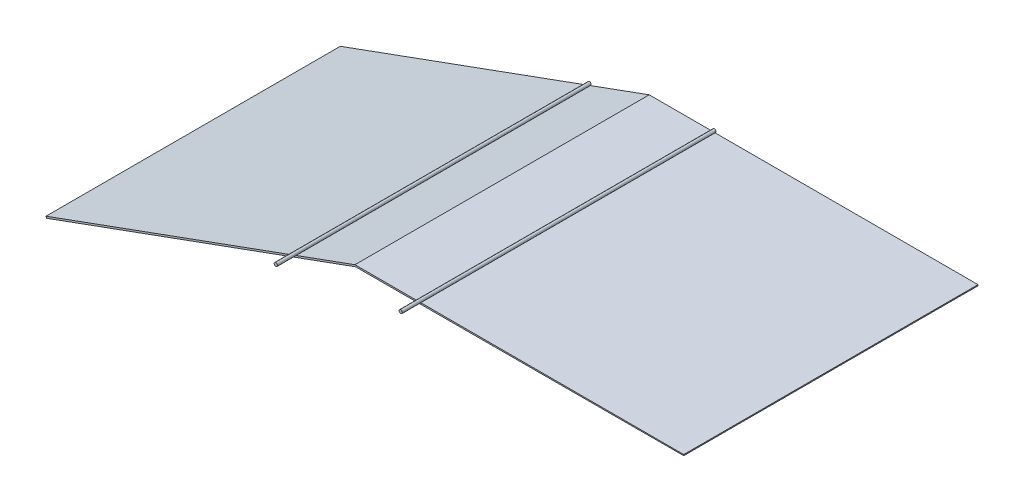
ISO-10303-21;
HEADER;
FILE_DESCRIPTION(('STEP AP214'),'2;1');
FILE_NAME('part.step','',(''),(''),'','','');
FILE_SCHEMA(('AUTOMOTIVE_DESIGN { 1 0 10303 214 1 1 1 1 }'));
ENDSEC;
DATA;
#1=APPLICATION_CONTEXT('core data for automotive mechanical design processes');
#2=APPLICATION_PROTOCOL_DEFINITION('international standard','automotive_design',2000,#1);
#3=PRODUCT_CONTEXT('',#1,'mechanical');
#4=PRODUCT('Part','Part','',(#3));
#5=PRODUCT_RELATED_PRODUCT_CATEGORY('part','',(#4));
#6=PRODUCT_DEFINITION_FORMATION('','',#4);
#7=PRODUCT_DEFINITION_CONTEXT('part definition',#1,'design');
#8=PRODUCT_DEFINITION('design','',#6,#7);
#9=PRODUCT_DEFINITION_SHAPE('','',#8);
#10=(LENGTH_UNIT() NAMED_UNIT(*) SI_UNIT(.MILLI.,.METRE.));
#11=(NAMED_UNIT(*) PLANE_ANGLE_UNIT() SI_UNIT($,.RADIAN.));
#12=(NAMED_UNIT(*) SI_UNIT($,.STERADIAN.) SOLID_ANGLE_UNIT());
#13=UNCERTAINTY_MEASURE_WITH_UNIT(LENGTH_MEASURE(1.E-05),#10,'distance_accuracy_value','');
#14=(GEOMETRIC_REPRESENTATION_CONTEXT(3) GLOBAL_UNCERTAINTY_ASSIGNED_CONTEXT((#13)) GLOBAL_UNIT_ASSIGNED_CONTEXT((#10,
#11,#12)) REPRESENTATION_CONTEXT('',''));
#15=CARTESIAN_POINT('',(0.,0.,0.));
#16=DIRECTION('',(0.,0.,1.));
#17=DIRECTION('',(1.,0.,0.));
#18=AXIS2_PLACEMENT_3D('',#15,#16,#17);
#19=CARTESIAN_POINT('',(-238.371547445972,-60.799768218998,954.));
#20=DIRECTION('',(0.,0.,-1.));
#21=DIRECTION('',(-1.,0.,0.));
#22=AXIS2_PLACEMENT_3D('',#19,#20,#21);
#23=CYLINDRICAL_SURFACE('',#22,4.99999999999999);
#24=CARTESIAN_POINT('',(-238.371547445972,-60.799768218998,954.));
#25=DIRECTION('',(0.,0.,-1.));
#26=DIRECTION('',(-1.,0.,0.));
#27=AXIS2_PLACEMENT_3D('',#24,#25,#26);
#28=CIRCLE('',#27,4.99999999999999);
#29=CARTESIAN_POINT('',(-243.371547445972,-60.799768218998,954.));
#30=VERTEX_POINT('',#29);
#31=EDGE_CURVE('E11',#30,#30,#28,.T.);
#32=ORIENTED_EDGE('',*,*,#31,.T.);
#33=EDGE_LOOP('',(#32));
#34=FACE_BOUND('',#33,.T.);
#35=CARTESIAN_POINT('',(-238.371547445972,-60.799768218998,0.));
#36=DIRECTION('',(0.,0.,-1.));
#37=DIRECTION('',(-1.,0.,0.));
#38=AXIS2_PLACEMENT_3D('',#35,#36,#37);
#39=CIRCLE('',#38,4.99999999999999);
#40=CARTESIAN_POINT('',(-243.371547445972,-60.799768218998,0.));
#41=VERTEX_POINT('',#40);
#42=EDGE_CURVE('E47',#41,#41,#39,.T.);
#43=ORIENTED_EDGE('',*,*,#42,.F.);
#44=EDGE_LOOP('',(#43));
#45=FACE_BOUND('',#44,.T.);
#46=ADVANCED_FACE('F44',(#34,#45),#23,.T.);
#47=CARTESIAN_POINT('',(-238.371547445972,-60.799768218998,954.));
#48=DIRECTION('',(0.,0.,-1.));
#49=DIRECTION('',(-1.,0.,0.));
#50=AXIS2_PLACEMENT_3D('',#47,#48,#49);
#51=PLANE('',#50);
#52=ORIENTED_EDGE('',*,*,#31,.F.);
#53=EDGE_LOOP('',(#52));
#54=FACE_BOUND('',#53,.T.);
#55=ADVANCED_FACE('F59',(#54),#51,.F.);
#56=CARTESIAN_POINT('',(-238.371547445972,-60.799768218998,0.));
#57=DIRECTION('',(0.,0.,-1.));
#58=DIRECTION('',(-1.,0.,0.));
#59=AXIS2_PLACEMENT_3D('',#56,#57,#58);
#60=PLANE('',#59);
#61=ORIENTED_EDGE('',*,*,#42,.T.);
#62=EDGE_LOOP('',(#61));
#63=FACE_BOUND('',#62,.T.);
#64=ADVANCED_FACE('F56',(#63),#60,.T.);
#65=CLOSED_SHELL('',(#46,#55,#64));
#66=MANIFOLD_SOLID_BREP('B2',#65);
#67=CARTESIAN_POINT('',(141.531462955562,5.0000000000001,954.));
#68=DIRECTION('',(0.,0.,-1.));
#69=DIRECTION('',(-1.,0.,0.));
#70=AXIS2_PLACEMENT_3D('',#67,#68,#69);
#71=CYLINDRICAL_SURFACE('',#70,4.99999999999999);
#72=CARTESIAN_POINT('',(141.531462955562,5.0000000000001,954.));
#73=DIRECTION('',(0.,0.,-1.));
#74=DIRECTION('',(-1.,0.,0.));
#75=AXIS2_PLACEMENT_3D('',#72,#73,#74);
#76=CIRCLE('',#75,4.99999999999999);
#77=CARTESIAN_POINT('',(136.531462955562,5.0000000000001,954.));
#78=VERTEX_POINT('',#77);
#79=EDGE_CURVE('E43',#78,#78,#76,.T.);
#80=ORIENTED_EDGE('',*,*,#79,.T.);
#81=EDGE_LOOP('',(#80));
#82=FACE_BOUND('',#81,.T.);
#83=CARTESIAN_POINT('',(141.531462955562,5.0000000000001,0.));
#84=DIRECTION('',(0.,0.,-1.));
#85=DIRECTION('',(-1.,0.,0.));
#86=AXIS2_PLACEMENT_3D('',#83,#84,#85);
#87=CIRCLE('',#86,4.99999999999999);
#88=CARTESIAN_POINT('',(136.531462955562,5.0000000000001,0.));
#89=VERTEX_POINT('',#88);
#90=EDGE_CURVE('E97',#89,#89,#87,.T.);
#91=ORIENTED_EDGE('',*,*,#90,.F.);
#92=EDGE_LOOP('',(#91));
#93=FACE_BOUND('',#92,.T.);
#94=ADVANCED_FACE('F94',(#82,#93),#71,.T.);
#95=CARTESIAN_POINT('',(141.531462955562,5.0000000000001,954.));
#96=DIRECTION('',(0.,0.,-1.));
#97=DIRECTION('',(-1.,0.,0.));
#98=AXIS2_PLACEMENT_3D('',#95,#96,#97);
#99=PLANE('',#98);
#100=ORIENTED_EDGE('',*,*,#79,.F.);
#101=EDGE_LOOP('',(#100));
#102=FACE_BOUND('',#101,.T.);
#103=ADVANCED_FACE('F109',(#102),#99,.F.);
#104=CARTESIAN_POINT('',(141.531462955562,5.0000000000001,0.));
#105=DIRECTION('',(0.,0.,-1.));
#106=DIRECTION('',(-1.,0.,0.));
#107=AXIS2_PLACEMENT_3D('',#104,#105,#106);
#108=PLANE('',#107);
#109=ORIENTED_EDGE('',*,*,#90,.T.);
#110=EDGE_LOOP('',(#109));
#111=FACE_BOUND('',#110,.T.);
#112=ADVANCED_FACE('F106',(#111),#108,.T.);
#113=CLOSED_SHELL('',(#94,#103,#112));
#114=MANIFOLD_SOLID_BREP('B6',#113);
#115=CARTESIAN_POINT('',(943.293464844614,-3.1566372886378,895.));
#116=DIRECTION('',(-1.,0.,0.));
#117=DIRECTION('',(0.,0.,1.));
#118=AXIS2_PLACEMENT_3D('',#115,#116,#117);
#119=PLANE('',#118);
#120=DIRECTION('',(0.,1.,0.));
#121=VECTOR('',#120,1.);
#122=CARTESIAN_POINT('',(943.293464844614,-3.1566372886378,0.));
#123=LINE('',#122,#121);
#124=CARTESIAN_POINT('',(943.293464844614,-3.1566372886378,0.));
#125=VERTEX_POINT('',#124);
#126=CARTESIAN_POINT('',(943.293464844614,1.07549553584146E-13,0.));
#127=VERTEX_POINT('',#126);
#128=EDGE_CURVE('E219',#125,#127,#123,.T.);
#129=ORIENTED_EDGE('',*,*,#128,.T.);
#130=DIRECTION('',(0.,0.,-1.));
#131=VECTOR('',#130,1.);
#132=CARTESIAN_POINT('',(943.293464844614,1.07549553584146E-13,895.));
#133=LINE('',#132,#131);
#134=CARTESIAN_POINT('',(943.293464844614,1.07549553584146E-13,895.));
#135=VERTEX_POINT('',#134);
#136=EDGE_CURVE('E92',#135,#127,#133,.T.);
#137=ORIENTED_EDGE('',*,*,#136,.F.);
#138=DIRECTION('',(0.,1.,0.));
#139=VECTOR('',#138,1.);
#140=CARTESIAN_POINT('',(943.293464844614,-3.1566372886378,895.));
#141=LINE('',#140,#139);
#142=CARTESIAN_POINT('',(943.293464844614,-3.1566372886378,895.));
#143=VERTEX_POINT('',#142);
#144=EDGE_CURVE('E229',#143,#135,#141,.T.);
#145=ORIENTED_EDGE('',*,*,#144,.F.);
#146=DIRECTION('',(0.,0.,-1.));
#147=VECTOR('',#146,1.);
#148=CARTESIAN_POINT('',(943.293464844614,-3.1566372886378,895.));
#149=LINE('',#148,#147);
#150=EDGE_CURVE('E215',#143,#125,#149,.T.);
#151=ORIENTED_EDGE('',*,*,#150,.T.);
#152=EDGE_LOOP('',(#129,#137,#145,#151));
#153=FACE_BOUND('',#152,.T.);
#154=ADVANCED_FACE('F135',(#153),#119,.F.);
#155=CARTESIAN_POINT('',(943.293464844614,1.07549553584146E-13,895.));
#156=DIRECTION('',(0.,-1.,0.));
#157=DIRECTION('',(1.,0.,0.));
#158=AXIS2_PLACEMENT_3D('',#155,#156,#157);
#159=PLANE('',#158);
#160=DIRECTION('',(-1.,0.,0.));
#161=VECTOR('',#160,1.);
#162=CARTESIAN_POINT('',(943.293464844614,1.07549553584146E-13,0.));
#163=LINE('',#162,#161);
#164=CARTESIAN_POINT('',(-56.7065351553857,0.,0.));
#165=VERTEX_POINT('',#164);
#166=EDGE_CURVE('E222',#127,#165,#163,.T.);
#167=ORIENTED_EDGE('',*,*,#166,.T.);
#168=DIRECTION('',(0.,0.,-1.));
#169=VECTOR('',#168,1.);
#170=CARTESIAN_POINT('',(-56.7065351553857,0.,895.));
#171=LINE('',#170,#169);
#172=CARTESIAN_POINT('',(-56.7065351553857,0.,895.));
#173=VERTEX_POINT('',#172);
#174=EDGE_CURVE('E143',#173,#165,#171,.T.);
#175=ORIENTED_EDGE('',*,*,#174,.F.);
#176=DIRECTION('',(-1.,0.,0.));
#177=VECTOR('',#176,1.);
#178=CARTESIAN_POINT('',(943.293464844614,1.07549553584146E-13,895.));
#179=LINE('',#178,#177);
#180=EDGE_CURVE('E188',#135,#173,#179,.T.);
#181=ORIENTED_EDGE('',*,*,#180,.F.);
#182=ORIENTED_EDGE('',*,*,#136,.T.);
#183=EDGE_LOOP('',(#167,#175,#181,#182));
#184=FACE_BOUND('',#183,.T.);
#185=ADVANCED_FACE('F253',(#184),#159,.F.);
#186=CARTESIAN_POINT('',(-56.7065351553857,0.,895.));
#187=DIRECTION('',(0.34202014332567,-0.939692620785908,0.));
#188=DIRECTION('',(0.939692620785908,0.34202014332567,0.));
#189=AXIS2_PLACEMENT_3D('',#186,#187,#188);
#190=PLANE('',#189);
#191=DIRECTION('',(-0.939692620785908,-0.34202014332567,0.));
#192=VECTOR('',#191,1.);
#193=CARTESIAN_POINT('',(-56.7065351553857,0.,0.));
#194=LINE('',#193,#192);
#195=CARTESIAN_POINT('',(-996.399155941294,-342.02014332567,0.));
#196=VERTEX_POINT('',#195);
#197=EDGE_CURVE('E224',#165,#196,#194,.T.);
#198=ORIENTED_EDGE('',*,*,#197,.T.);
#199=DIRECTION('',(0.,0.,-1.));
#200=VECTOR('',#199,1.);
#201=CARTESIAN_POINT('',(-996.399155941294,-342.02014332567,895.));
#202=LINE('',#201,#200);
#203=CARTESIAN_POINT('',(-996.399155941294,-342.02014332567,895.));
#204=VERTEX_POINT('',#203);
#205=EDGE_CURVE('E210',#204,#196,#202,.T.);
#206=ORIENTED_EDGE('',*,*,#205,.F.);
#207=DIRECTION('',(-0.939692620785908,-0.34202014332567,0.));
#208=VECTOR('',#207,1.);
#209=CARTESIAN_POINT('',(-56.7065351553857,0.,895.));
#210=LINE('',#209,#208);
#211=EDGE_CURVE('E201',#173,#204,#210,.T.);
#212=ORIENTED_EDGE('',*,*,#211,.F.);
#213=ORIENTED_EDGE('',*,*,#174,.T.);
#214=EDGE_LOOP('',(#198,#206,#212,#213));
#215=FACE_BOUND('',#214,.T.);
#216=ADVANCED_FACE('F235',(#215),#190,.F.);
#217=CARTESIAN_POINT('',(-996.399155941294,-342.02014332567,895.));
#218=DIRECTION('',(0.939692620785907,0.342020143325673,0.));
#219=DIRECTION('',(-0.342020143325673,0.939692620785907,0.));
#220=AXIS2_PLACEMENT_3D('',#217,#218,#219);
#221=PLANE('',#220);
#222=DIRECTION('',(0.342020143325673,-0.939692620785907,0.));
#223=VECTOR('',#222,1.);
#224=CARTESIAN_POINT('',(-996.399155941294,-342.02014332567,0.));
#225=LINE('',#224,#223);
#226=CARTESIAN_POINT('',(-994.689055224665,-346.718606429599,0.));
#227=VERTEX_POINT('',#226);
#228=EDGE_CURVE('E209',#196,#227,#225,.T.);
#229=ORIENTED_EDGE('',*,*,#228,.T.);
#230=DIRECTION('',(0.,0.,-1.));
#231=VECTOR('',#230,1.);
#232=CARTESIAN_POINT('',(-994.689055224665,-346.718606429599,895.));
#233=LINE('',#232,#231);
#234=CARTESIAN_POINT('',(-994.689055224665,-346.718606429599,895.));
#235=VERTEX_POINT('',#234);
#236=EDGE_CURVE('E206',#235,#227,#233,.T.);
#237=ORIENTED_EDGE('',*,*,#236,.F.);
#238=DIRECTION('',(0.342020143325673,-0.939692620785907,0.));
#239=VECTOR('',#238,1.);
#240=CARTESIAN_POINT('',(-996.399155941294,-342.02014332567,895.));
#241=LINE('',#240,#239);
#242=EDGE_CURVE('E195',#204,#235,#241,.T.);
#243=ORIENTED_EDGE('',*,*,#242,.F.);
#244=ORIENTED_EDGE('',*,*,#205,.T.);
#245=EDGE_LOOP('',(#229,#237,#243,#244));
#246=FACE_BOUND('',#245,.T.);
#247=ADVANCED_FACE('F207',(#246),#221,.F.);
#248=CARTESIAN_POINT('',(-994.689055224665,-346.718606429599,895.));
#249=DIRECTION('',(-0.342020143325673,0.939692620785907,0.));
#250=DIRECTION('',(-0.939692620785907,-0.342020143325673,0.));
#251=AXIS2_PLACEMENT_3D('',#248,#249,#250);
#252=PLANE('',#251);
#253=DIRECTION('',(0.939692620785907,0.342020143325673,0.));
#254=VECTOR('',#253,1.);
#255=CARTESIAN_POINT('',(-994.689055224665,-346.718606429599,0.));
#256=LINE('',#255,#254);
#257=CARTESIAN_POINT('',(-54.9964344387587,-4.69846310392591,0.));
#258=VERTEX_POINT('',#257);
#259=EDGE_CURVE('E174',#227,#258,#256,.T.);
#260=ORIENTED_EDGE('',*,*,#259,.T.);
#261=DIRECTION('',(0.,0.,-1.));
#262=VECTOR('',#261,1.);
#263=CARTESIAN_POINT('',(-54.9964344387587,-4.69846310392591,895.));
#264=LINE('',#263,#262);
#265=CARTESIAN_POINT('',(-54.9964344387587,-4.69846310392591,895.));
#266=VERTEX_POINT('',#265);
#267=EDGE_CURVE('E211',#266,#258,#264,.T.);
#268=ORIENTED_EDGE('',*,*,#267,.F.);
#269=DIRECTION('',(0.939692620785907,0.342020143325673,0.));
#270=VECTOR('',#269,1.);
#271=CARTESIAN_POINT('',(-994.689055224665,-346.718606429599,895.));
#272=LINE('',#271,#270);
#273=EDGE_CURVE('E199',#235,#266,#272,.T.);
#274=ORIENTED_EDGE('',*,*,#273,.F.);
#275=ORIENTED_EDGE('',*,*,#236,.T.);
#276=EDGE_LOOP('',(#260,#268,#274,#275));
#277=FACE_BOUND('',#276,.T.);
#278=ADVANCED_FACE('F213',(#277),#252,.F.);
#279=CARTESIAN_POINT('',(-54.9964344387587,-4.69846310392591,895.));
#280=DIRECTION('',(-0.00154446516736196,0.999998807312962,0.));
#281=DIRECTION('',(-0.999998807312962,-0.00154446516736196,0.));
#282=AXIS2_PLACEMENT_3D('',#279,#280,#281);
#283=PLANE('',#282);
#284=DIRECTION('',(0.999998807312962,0.00154446516736196,0.));
#285=VECTOR('',#284,1.);
#286=CARTESIAN_POINT('',(-54.9964344387587,-4.69846310392591,0.));
#287=LINE('',#286,#285);
#288=EDGE_CURVE('E180',#258,#125,#287,.T.);
#289=ORIENTED_EDGE('',*,*,#288,.T.);
#290=ORIENTED_EDGE('',*,*,#150,.F.);
#291=DIRECTION('',(0.999998807312962,0.00154446516736196,0.));
#292=VECTOR('',#291,1.);
#293=CARTESIAN_POINT('',(-54.9964344387587,-4.69846310392591,895.));
#294=LINE('',#293,#292);
#295=EDGE_CURVE('E151',#266,#143,#294,.T.);
#296=ORIENTED_EDGE('',*,*,#295,.F.);
#297=ORIENTED_EDGE('',*,*,#267,.T.);
#298=EDGE_LOOP('',(#289,#290,#296,#297));
#299=FACE_BOUND('',#298,.T.);
#300=ADVANCED_FACE('F242',(#299),#283,.F.);
#301=CARTESIAN_POINT('',(0.,0.,895.));
#302=DIRECTION('',(0.,0.,1.));
#303=DIRECTION('',(1.,0.,0.));
#304=AXIS2_PLACEMENT_3D('',#301,#302,#303);
#305=PLANE('',#304);
#306=ORIENTED_EDGE('',*,*,#144,.T.);
#307=ORIENTED_EDGE('',*,*,#180,.T.);
#308=ORIENTED_EDGE('',*,*,#211,.T.);
#309=ORIENTED_EDGE('',*,*,#242,.T.);
#310=ORIENTED_EDGE('',*,*,#273,.T.);
#311=ORIENTED_EDGE('',*,*,#295,.T.);
#312=EDGE_LOOP('',(#306,#307,#308,#309,#310,#311));
#313=FACE_BOUND('',#312,.T.);
#314=ADVANCED_FACE('F197',(#313),#305,.T.);
#315=CARTESIAN_POINT('',(0.,0.,0.));
#316=DIRECTION('',(0.,0.,1.));
#317=DIRECTION('',(1.,0.,0.));
#318=AXIS2_PLACEMENT_3D('',#315,#316,#317);
#319=PLANE('',#318);
#320=ORIENTED_EDGE('',*,*,#128,.F.);
#321=ORIENTED_EDGE('',*,*,#288,.F.);
#322=ORIENTED_EDGE('',*,*,#259,.F.);
#323=ORIENTED_EDGE('',*,*,#228,.F.);
#324=ORIENTED_EDGE('',*,*,#197,.F.);
#325=ORIENTED_EDGE('',*,*,#166,.F.);
#326=EDGE_LOOP('',(#320,#321,#322,#323,#324,#325));
#327=FACE_BOUND('',#326,.T.);
#328=ADVANCED_FACE('F238',(#327),#319,.F.);
#329=CLOSED_SHELL('',(#154,#185,#216,#247,#278,#300,#314,#328));
#330=MANIFOLD_SOLID_BREP('B38',#329);
#331=ADVANCED_BREP_SHAPE_REPRESENTATION('',(#18,#66,#114,#330),#14);
#332=SHAPE_DEFINITION_REPRESENTATION(#9,#331);
ENDSEC;
END-ISO-10303-21;
